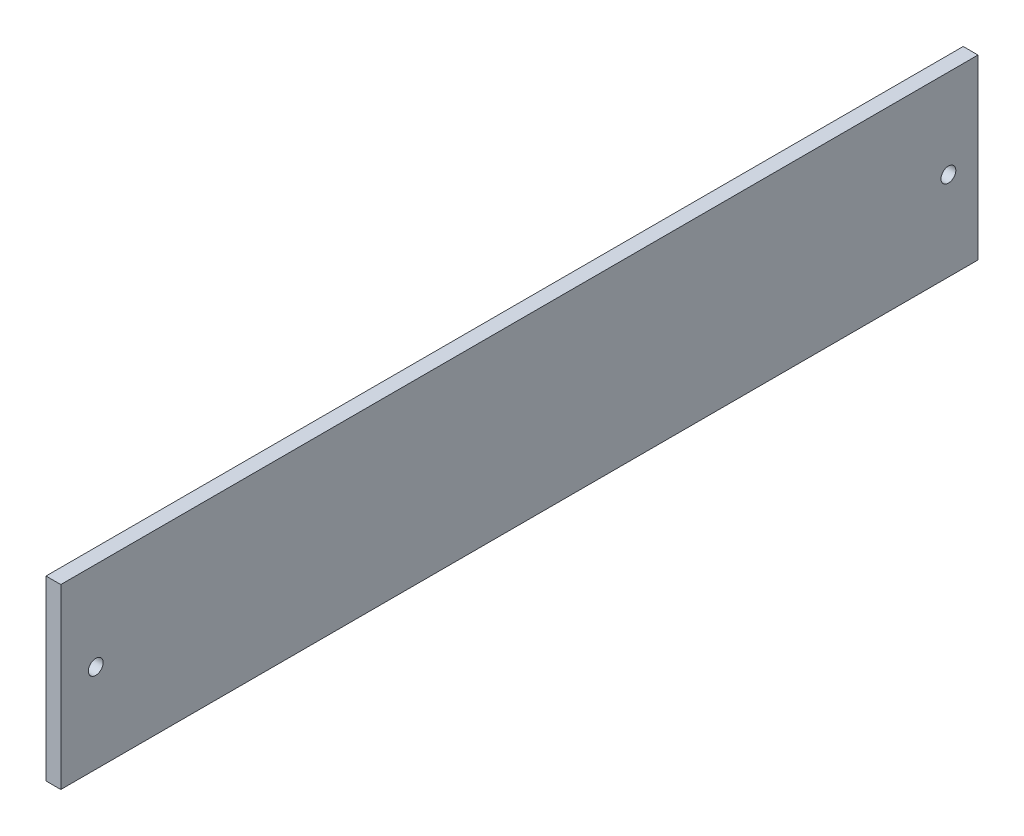
ISO-10303-21;
HEADER;
FILE_DESCRIPTION(('STEP AP214'),'2;1');
FILE_NAME('part.step','',(''),(''),'','','');
FILE_SCHEMA(('AUTOMOTIVE_DESIGN { 1 0 10303 214 1 1 1 1 }'));
ENDSEC;
DATA;
#1=APPLICATION_CONTEXT('core data for automotive mechanical design processes');
#2=APPLICATION_PROTOCOL_DEFINITION('international standard','automotive_design',2000,#1);
#3=PRODUCT_CONTEXT('',#1,'mechanical');
#4=PRODUCT('Part','Part','',(#3));
#5=PRODUCT_RELATED_PRODUCT_CATEGORY('part','',(#4));
#6=PRODUCT_DEFINITION_FORMATION('','',#4);
#7=PRODUCT_DEFINITION_CONTEXT('part definition',#1,'design');
#8=PRODUCT_DEFINITION('design','',#6,#7);
#9=PRODUCT_DEFINITION_SHAPE('','',#8);
#10=(LENGTH_UNIT() NAMED_UNIT(*) SI_UNIT(.MILLI.,.METRE.));
#11=(NAMED_UNIT(*) PLANE_ANGLE_UNIT() SI_UNIT($,.RADIAN.));
#12=(NAMED_UNIT(*) SI_UNIT($,.STERADIAN.) SOLID_ANGLE_UNIT());
#13=UNCERTAINTY_MEASURE_WITH_UNIT(LENGTH_MEASURE(1.E-05),#10,'distance_accuracy_value','');
#14=(GEOMETRIC_REPRESENTATION_CONTEXT(3) GLOBAL_UNCERTAINTY_ASSIGNED_CONTEXT((#13)) GLOBAL_UNIT_ASSIGNED_CONTEXT((#10,
#11,#12)) REPRESENTATION_CONTEXT('',''));
#15=CARTESIAN_POINT('',(0.,0.,0.));
#16=DIRECTION('',(0.,0.,1.));
#17=DIRECTION('',(1.,0.,0.));
#18=AXIS2_PLACEMENT_3D('',#15,#16,#17);
#19=CARTESIAN_POINT('',(6.35,-38.1,196.85));
#20=DIRECTION('',(0.,0.,-1.));
#21=DIRECTION('',(-1.,0.,0.));
#22=AXIS2_PLACEMENT_3D('',#19,#20,#21);
#23=PLANE('',#22);
#24=DIRECTION('',(0.,-1.,0.));
#25=VECTOR('',#24,1.);
#26=CARTESIAN_POINT('',(0.,-38.1,196.85));
#27=LINE('',#26,#25);
#28=CARTESIAN_POINT('',(0.,38.1,196.85));
#29=VERTEX_POINT('',#28);
#30=CARTESIAN_POINT('',(0.,-38.1,196.85));
#31=VERTEX_POINT('',#30);
#32=EDGE_CURVE('E96',#29,#31,#27,.T.);
#33=ORIENTED_EDGE('',*,*,#32,.T.);
#34=DIRECTION('',(-1.,0.,0.));
#35=VECTOR('',#34,1.);
#36=CARTESIAN_POINT('',(6.35,-38.1,196.85));
#37=LINE('',#36,#35);
#38=CARTESIAN_POINT('',(6.35,-38.1,196.85));
#39=VERTEX_POINT('',#38);
#40=EDGE_CURVE('E11',#39,#31,#37,.T.);
#41=ORIENTED_EDGE('',*,*,#40,.F.);
#42=DIRECTION('',(0.,-1.,0.));
#43=VECTOR('',#42,1.);
#44=CARTESIAN_POINT('',(6.35,-38.1,196.85));
#45=LINE('',#44,#43);
#46=CARTESIAN_POINT('',(6.35,38.1,196.85));
#47=VERTEX_POINT('',#46);
#48=EDGE_CURVE('E84',#47,#39,#45,.T.);
#49=ORIENTED_EDGE('',*,*,#48,.F.);
#50=DIRECTION('',(-1.,0.,0.));
#51=VECTOR('',#50,1.);
#52=CARTESIAN_POINT('',(6.35,38.1,196.85));
#53=LINE('',#52,#51);
#54=EDGE_CURVE('E92',#47,#29,#53,.T.);
#55=ORIENTED_EDGE('',*,*,#54,.T.);
#56=EDGE_LOOP('',(#33,#41,#49,#55));
#57=FACE_BOUND('',#56,.T.);
#58=ADVANCED_FACE('F33',(#57),#23,.F.);
#59=CARTESIAN_POINT('',(6.35,-38.1,-196.85));
#60=DIRECTION('',(0.,1.,0.));
#61=DIRECTION('',(0.,0.,1.));
#62=AXIS2_PLACEMENT_3D('',#59,#60,#61);
#63=PLANE('',#62);
#64=DIRECTION('',(0.,0.,-1.));
#65=VECTOR('',#64,1.);
#66=CARTESIAN_POINT('',(0.,-38.1,-196.85));
#67=LINE('',#66,#65);
#68=CARTESIAN_POINT('',(0.,-38.1,-196.85));
#69=VERTEX_POINT('',#68);
#70=EDGE_CURVE('E88',#31,#69,#67,.T.);
#71=ORIENTED_EDGE('',*,*,#70,.T.);
#72=DIRECTION('',(-1.,0.,0.));
#73=VECTOR('',#72,1.);
#74=CARTESIAN_POINT('',(6.35,-38.1,-196.85));
#75=LINE('',#74,#73);
#76=CARTESIAN_POINT('',(6.35,-38.1,-196.85));
#77=VERTEX_POINT('',#76);
#78=EDGE_CURVE('E41',#77,#69,#75,.T.);
#79=ORIENTED_EDGE('',*,*,#78,.F.);
#80=DIRECTION('',(0.,0.,-1.));
#81=VECTOR('',#80,1.);
#82=CARTESIAN_POINT('',(6.35,-38.1,-196.85));
#83=LINE('',#82,#81);
#84=EDGE_CURVE('E79',#39,#77,#83,.T.);
#85=ORIENTED_EDGE('',*,*,#84,.F.);
#86=ORIENTED_EDGE('',*,*,#40,.T.);
#87=EDGE_LOOP('',(#71,#79,#85,#86));
#88=FACE_BOUND('',#87,.T.);
#89=ADVANCED_FACE('F87',(#88),#63,.F.);
#90=CARTESIAN_POINT('',(6.35,-38.1,-196.85));
#91=DIRECTION('',(0.,0.,1.));
#92=DIRECTION('',(1.,0.,0.));
#93=AXIS2_PLACEMENT_3D('',#90,#91,#92);
#94=PLANE('',#93);
#95=DIRECTION('',(0.,1.,0.));
#96=VECTOR('',#95,1.);
#97=CARTESIAN_POINT('',(0.,-38.1,-196.85));
#98=LINE('',#97,#96);
#99=CARTESIAN_POINT('',(0.,38.1,-196.85));
#100=VERTEX_POINT('',#99);
#101=EDGE_CURVE('E66',#69,#100,#98,.T.);
#102=ORIENTED_EDGE('',*,*,#101,.T.);
#103=DIRECTION('',(-1.,0.,0.));
#104=VECTOR('',#103,1.);
#105=CARTESIAN_POINT('',(6.35,38.1,-196.85));
#106=LINE('',#105,#104);
#107=CARTESIAN_POINT('',(6.35,38.1,-196.85));
#108=VERTEX_POINT('',#107);
#109=EDGE_CURVE('E89',#108,#100,#106,.T.);
#110=ORIENTED_EDGE('',*,*,#109,.F.);
#111=DIRECTION('',(0.,1.,0.));
#112=VECTOR('',#111,1.);
#113=CARTESIAN_POINT('',(6.35,-38.1,-196.85));
#114=LINE('',#113,#112);
#115=EDGE_CURVE('E82',#77,#108,#114,.T.);
#116=ORIENTED_EDGE('',*,*,#115,.F.);
#117=ORIENTED_EDGE('',*,*,#78,.T.);
#118=EDGE_LOOP('',(#102,#110,#116,#117));
#119=FACE_BOUND('',#118,.T.);
#120=ADVANCED_FACE('F90',(#119),#94,.F.);
#121=CARTESIAN_POINT('',(6.35,38.1,-196.85));
#122=DIRECTION('',(0.,-1.,0.));
#123=DIRECTION('',(0.,0.,-1.));
#124=AXIS2_PLACEMENT_3D('',#121,#122,#123);
#125=PLANE('',#124);
#126=DIRECTION('',(0.,0.,1.));
#127=VECTOR('',#126,1.);
#128=CARTESIAN_POINT('',(0.,38.1,-196.85));
#129=LINE('',#128,#127);
#130=EDGE_CURVE('E72',#100,#29,#129,.T.);
#131=ORIENTED_EDGE('',*,*,#130,.T.);
#132=ORIENTED_EDGE('',*,*,#54,.F.);
#133=DIRECTION('',(0.,0.,1.));
#134=VECTOR('',#133,1.);
#135=CARTESIAN_POINT('',(6.35,38.1,-196.85));
#136=LINE('',#135,#134);
#137=EDGE_CURVE('E49',#108,#47,#136,.T.);
#138=ORIENTED_EDGE('',*,*,#137,.F.);
#139=ORIENTED_EDGE('',*,*,#109,.T.);
#140=EDGE_LOOP('',(#131,#132,#138,#139));
#141=FACE_BOUND('',#140,.T.);
#142=ADVANCED_FACE('F104',(#141),#125,.F.);
#143=CARTESIAN_POINT('',(6.35,0.,0.));
#144=DIRECTION('',(1.,0.,0.));
#145=DIRECTION('',(0.,0.,-1.));
#146=AXIS2_PLACEMENT_3D('',#143,#144,#145);
#147=PLANE('',#146);
#148=CARTESIAN_POINT('',(6.35,0.,-184.15));
#149=DIRECTION('',(1.,0.,0.));
#150=DIRECTION('',(0.,0.,-1.));
#151=AXIS2_PLACEMENT_3D('',#148,#149,#150);
#152=CIRCLE('',#151,3.175);
#153=CARTESIAN_POINT('',(6.35,0.,-180.975));
#154=VERTEX_POINT('',#153);
#155=EDGE_CURVE('E115',#154,#154,#152,.F.);
#156=ORIENTED_EDGE('',*,*,#155,.T.);
#157=EDGE_LOOP('',(#156));
#158=FACE_BOUND('',#157,.T.);
#159=CARTESIAN_POINT('',(6.35,0.,181.85));
#160=DIRECTION('',(1.,0.,0.));
#161=DIRECTION('',(0.,0.,-1.));
#162=AXIS2_PLACEMENT_3D('',#159,#160,#161);
#163=CIRCLE('',#162,3.175);
#164=CARTESIAN_POINT('',(6.35,0.,185.025));
#165=VERTEX_POINT('',#164);
#166=EDGE_CURVE('E99',#165,#165,#163,.F.);
#167=ORIENTED_EDGE('',*,*,#166,.T.);
#168=EDGE_LOOP('',(#167));
#169=FACE_BOUND('',#168,.T.);
#170=ORIENTED_EDGE('',*,*,#48,.T.);
#171=ORIENTED_EDGE('',*,*,#84,.T.);
#172=ORIENTED_EDGE('',*,*,#115,.T.);
#173=ORIENTED_EDGE('',*,*,#137,.T.);
#174=EDGE_LOOP('',(#170,#171,#172,#173));
#175=FACE_BOUND('',#174,.T.);
#176=ADVANCED_FACE('F80',(#158,#169,#175),#147,.T.);
#177=CARTESIAN_POINT('',(0.,0.,0.));
#178=DIRECTION('',(1.,0.,0.));
#179=DIRECTION('',(0.,0.,-1.));
#180=AXIS2_PLACEMENT_3D('',#177,#178,#179);
#181=PLANE('',#180);
#182=CARTESIAN_POINT('',(0.,0.,-184.15));
#183=DIRECTION('',(-1.,0.,0.));
#184=DIRECTION('',(0.,0.,1.));
#185=AXIS2_PLACEMENT_3D('',#182,#183,#184);
#186=CIRCLE('',#185,3.175);
#187=CARTESIAN_POINT('',(0.,0.,-180.975));
#188=VERTEX_POINT('',#187);
#189=EDGE_CURVE('E118',#188,#188,#186,.T.);
#190=ORIENTED_EDGE('',*,*,#189,.F.);
#191=EDGE_LOOP('',(#190));
#192=FACE_BOUND('',#191,.T.);
#193=CARTESIAN_POINT('',(0.,0.,181.85));
#194=DIRECTION('',(-1.,0.,0.));
#195=DIRECTION('',(0.,0.,1.));
#196=AXIS2_PLACEMENT_3D('',#193,#194,#195);
#197=CIRCLE('',#196,3.175);
#198=CARTESIAN_POINT('',(0.,0.,185.025));
#199=VERTEX_POINT('',#198);
#200=EDGE_CURVE('E112',#199,#199,#197,.T.);
#201=ORIENTED_EDGE('',*,*,#200,.F.);
#202=EDGE_LOOP('',(#201));
#203=FACE_BOUND('',#202,.T.);
#204=ORIENTED_EDGE('',*,*,#32,.F.);
#205=ORIENTED_EDGE('',*,*,#130,.F.);
#206=ORIENTED_EDGE('',*,*,#101,.F.);
#207=ORIENTED_EDGE('',*,*,#70,.F.);
#208=EDGE_LOOP('',(#204,#205,#206,#207));
#209=FACE_BOUND('',#208,.T.);
#210=ADVANCED_FACE('F107',(#192,#203,#209),#181,.F.);
#211=CARTESIAN_POINT('',(15.3302561210692,0.,181.85));
#212=DIRECTION('',(-1.,0.,0.));
#213=DIRECTION('',(0.,0.,1.));
#214=AXIS2_PLACEMENT_3D('',#211,#212,#213);
#215=CYLINDRICAL_SURFACE('',#214,3.175);
#216=CARTESIAN_POINT('',(0.,0.,185.025));
#217=CARTESIAN_POINT('',(0.0661458333333336,0.,185.025));
#218=CARTESIAN_POINT('',(0.132291666666667,0.,185.025));
#219=CARTESIAN_POINT('',(0.264583333333334,0.,185.025));
#220=CARTESIAN_POINT('',(0.330729166666667,0.,185.025));
#221=CARTESIAN_POINT('',(0.463020833333333,0.,185.025));
#222=CARTESIAN_POINT('',(0.529166666666667,0.,185.025));
#223=CARTESIAN_POINT('',(0.661458333333333,0.,185.025));
#224=CARTESIAN_POINT('',(0.727604166666666,0.,185.025));
#225=CARTESIAN_POINT('',(0.859895833333333,0.,185.025));
#226=CARTESIAN_POINT('',(0.926041666666666,0.,185.025));
#227=CARTESIAN_POINT('',(1.05833333333333,0.,185.025));
#228=CARTESIAN_POINT('',(1.12447916666667,0.,185.025));
#229=CARTESIAN_POINT('',(1.25677083333333,0.,185.025));
#230=CARTESIAN_POINT('',(1.32291666666667,0.,185.025));
#231=CARTESIAN_POINT('',(1.45520833333333,0.,185.025));
#232=CARTESIAN_POINT('',(1.52135416666667,0.,185.025));
#233=CARTESIAN_POINT('',(1.65364583333333,0.,185.025));
#234=CARTESIAN_POINT('',(1.71979166666667,0.,185.025));
#235=CARTESIAN_POINT('',(1.85208333333333,0.,185.025));
#236=CARTESIAN_POINT('',(1.91822916666667,0.,185.025));
#237=CARTESIAN_POINT('',(2.05052083333333,0.,185.025));
#238=CARTESIAN_POINT('',(2.11666666666667,0.,185.025));
#239=CARTESIAN_POINT('',(2.24895833333333,0.,185.025));
#240=CARTESIAN_POINT('',(2.31510416666667,0.,185.025));
#241=CARTESIAN_POINT('',(2.44739583333333,0.,185.025));
#242=CARTESIAN_POINT('',(2.51354166666667,0.,185.025));
#243=CARTESIAN_POINT('',(2.64583333333333,0.,185.025));
#244=CARTESIAN_POINT('',(2.71197916666667,0.,185.025));
#245=CARTESIAN_POINT('',(2.84427083333333,0.,185.025));
#246=CARTESIAN_POINT('',(2.91041666666667,0.,185.025));
#247=CARTESIAN_POINT('',(3.04270833333333,0.,185.025));
#248=CARTESIAN_POINT('',(3.10885416666667,0.,185.025));
#249=CARTESIAN_POINT('',(3.24114583333333,0.,185.025));
#250=CARTESIAN_POINT('',(3.30729166666667,0.,185.025));
#251=CARTESIAN_POINT('',(3.43958333333333,0.,185.025));
#252=CARTESIAN_POINT('',(3.50572916666667,0.,185.025));
#253=CARTESIAN_POINT('',(3.63802083333333,0.,185.025));
#254=CARTESIAN_POINT('',(3.70416666666667,0.,185.025));
#255=CARTESIAN_POINT('',(3.83645833333333,0.,185.025));
#256=CARTESIAN_POINT('',(3.90260416666667,0.,185.025));
#257=CARTESIAN_POINT('',(4.03489583333333,0.,185.025));
#258=CARTESIAN_POINT('',(4.10104166666667,0.,185.025));
#259=CARTESIAN_POINT('',(4.23333333333333,0.,185.025));
#260=CARTESIAN_POINT('',(4.29947916666667,0.,185.025));
#261=CARTESIAN_POINT('',(4.43177083333333,0.,185.025));
#262=CARTESIAN_POINT('',(4.49791666666667,0.,185.025));
#263=CARTESIAN_POINT('',(4.63020833333333,0.,185.025));
#264=CARTESIAN_POINT('',(4.69635416666667,0.,185.025));
#265=CARTESIAN_POINT('',(4.82864583333333,0.,185.025));
#266=CARTESIAN_POINT('',(4.89479166666667,0.,185.025));
#267=CARTESIAN_POINT('',(5.02708333333333,0.,185.025));
#268=CARTESIAN_POINT('',(5.09322916666666,0.,185.025));
#269=CARTESIAN_POINT('',(5.22552083333333,0.,185.025));
#270=CARTESIAN_POINT('',(5.29166666666666,0.,185.025));
#271=CARTESIAN_POINT('',(5.42395833333333,0.,185.025));
#272=CARTESIAN_POINT('',(5.49010416666667,0.,185.025));
#273=CARTESIAN_POINT('',(5.62239583333333,0.,185.025));
#274=CARTESIAN_POINT('',(5.68854166666666,0.,185.025));
#275=CARTESIAN_POINT('',(5.82083333333333,0.,185.025));
#276=CARTESIAN_POINT('',(5.88697916666666,0.,185.025));
#277=CARTESIAN_POINT('',(6.01927083333333,0.,185.025));
#278=CARTESIAN_POINT('',(6.08541666666667,0.,185.025));
#279=CARTESIAN_POINT('',(6.21770833333333,0.,185.025));
#280=CARTESIAN_POINT('',(6.28385416666667,0.,185.025));
#281=CARTESIAN_POINT('',(6.35,0.,185.025));
#282=B_SPLINE_CURVE_WITH_KNOTS('',3,(#216,#217,#218,#219,#220,#221,#222,#223,#224,#225,#226,
#227,#228,#229,#230,#231,#232,#233,#234,#235,#236,#237,#238,#239,#240,#241,#242,#243,#244,#245,
#246,#247,#248,#249,#250,#251,#252,#253,#254,#255,#256,#257,#258,#259,#260,#261,#262,#263,#264,
#265,#266,#267,#268,#269,#270,#271,#272,#273,#274,#275,#276,#277,#278,#279,#280,#281),
.UNSPECIFIED.,.F.,.F.,(4,2,2,2,2,2,2,2,2,2,2,2,2,2,2,2,2,2,2,2,2,2,2,2,2,2,2,2,2,2,2,2,4),(0.,
0.198437500000001,0.396875,0.5953125,0.793749999999999,0.9921875,1.190625,1.3890625,1.5875,
1.7859375,1.984375,2.1828125,2.38125,2.5796875,2.778125,2.9765625,3.175,3.3734375,3.571875,
3.7703125,3.96875,4.1671875,4.365625,4.5640625,4.7625,4.9609375,5.159375,5.3578125,5.55625,
5.7546875,5.953125,6.1515625,6.35),.UNSPECIFIED.);
#283=EDGE_CURVE('BSEAM127',#199,#165,#282,.T.);
#284=ORIENTED_EDGE('',*,*,#200,.T.);
#285=ORIENTED_EDGE('',*,*,#166,.F.);
#286=ORIENTED_EDGE('',*,*,#283,.T.);
#287=ORIENTED_EDGE('',*,*,#283,.F.);
#288=EDGE_LOOP('',(#284,#286,#285,#287));
#289=FACE_BOUND('',#288,.T.);
#290=ADVANCED_FACE('F127',(#289),#215,.F.);
#291=CARTESIAN_POINT('',(15.3302561210692,0.,-184.15));
#292=DIRECTION('',(-1.,0.,0.));
#293=DIRECTION('',(0.,0.,1.));
#294=AXIS2_PLACEMENT_3D('',#291,#292,#293);
#295=CYLINDRICAL_SURFACE('',#294,3.175);
#296=CARTESIAN_POINT('',(0.,0.,-180.975));
#297=CARTESIAN_POINT('',(0.0661458333333336,0.,-180.975));
#298=CARTESIAN_POINT('',(0.132291666666667,0.,-180.975));
#299=CARTESIAN_POINT('',(0.264583333333334,0.,-180.975));
#300=CARTESIAN_POINT('',(0.330729166666667,0.,-180.975));
#301=CARTESIAN_POINT('',(0.463020833333333,0.,-180.975));
#302=CARTESIAN_POINT('',(0.529166666666667,0.,-180.975));
#303=CARTESIAN_POINT('',(0.661458333333333,0.,-180.975));
#304=CARTESIAN_POINT('',(0.727604166666666,0.,-180.975));
#305=CARTESIAN_POINT('',(0.859895833333333,0.,-180.975));
#306=CARTESIAN_POINT('',(0.926041666666666,0.,-180.975));
#307=CARTESIAN_POINT('',(1.05833333333333,0.,-180.975));
#308=CARTESIAN_POINT('',(1.12447916666667,0.,-180.975));
#309=CARTESIAN_POINT('',(1.25677083333333,0.,-180.975));
#310=CARTESIAN_POINT('',(1.32291666666667,0.,-180.975));
#311=CARTESIAN_POINT('',(1.45520833333333,0.,-180.975));
#312=CARTESIAN_POINT('',(1.52135416666667,0.,-180.975));
#313=CARTESIAN_POINT('',(1.65364583333333,0.,-180.975));
#314=CARTESIAN_POINT('',(1.71979166666667,0.,-180.975));
#315=CARTESIAN_POINT('',(1.85208333333333,0.,-180.975));
#316=CARTESIAN_POINT('',(1.91822916666667,0.,-180.975));
#317=CARTESIAN_POINT('',(2.05052083333333,0.,-180.975));
#318=CARTESIAN_POINT('',(2.11666666666667,0.,-180.975));
#319=CARTESIAN_POINT('',(2.24895833333333,0.,-180.975));
#320=CARTESIAN_POINT('',(2.31510416666667,0.,-180.975));
#321=CARTESIAN_POINT('',(2.44739583333333,0.,-180.975));
#322=CARTESIAN_POINT('',(2.51354166666667,0.,-180.975));
#323=CARTESIAN_POINT('',(2.64583333333333,0.,-180.975));
#324=CARTESIAN_POINT('',(2.71197916666667,0.,-180.975));
#325=CARTESIAN_POINT('',(2.84427083333333,0.,-180.975));
#326=CARTESIAN_POINT('',(2.91041666666667,0.,-180.975));
#327=CARTESIAN_POINT('',(3.04270833333333,0.,-180.975));
#328=CARTESIAN_POINT('',(3.10885416666667,0.,-180.975));
#329=CARTESIAN_POINT('',(3.24114583333333,0.,-180.975));
#330=CARTESIAN_POINT('',(3.30729166666667,0.,-180.975));
#331=CARTESIAN_POINT('',(3.43958333333333,0.,-180.975));
#332=CARTESIAN_POINT('',(3.50572916666667,0.,-180.975));
#333=CARTESIAN_POINT('',(3.63802083333333,0.,-180.975));
#334=CARTESIAN_POINT('',(3.70416666666667,0.,-180.975));
#335=CARTESIAN_POINT('',(3.83645833333333,0.,-180.975));
#336=CARTESIAN_POINT('',(3.90260416666667,0.,-180.975));
#337=CARTESIAN_POINT('',(4.03489583333333,0.,-180.975));
#338=CARTESIAN_POINT('',(4.10104166666667,0.,-180.975));
#339=CARTESIAN_POINT('',(4.23333333333333,0.,-180.975));
#340=CARTESIAN_POINT('',(4.29947916666667,0.,-180.975));
#341=CARTESIAN_POINT('',(4.43177083333333,0.,-180.975));
#342=CARTESIAN_POINT('',(4.49791666666667,0.,-180.975));
#343=CARTESIAN_POINT('',(4.63020833333333,0.,-180.975));
#344=CARTESIAN_POINT('',(4.69635416666667,0.,-180.975));
#345=CARTESIAN_POINT('',(4.82864583333333,0.,-180.975));
#346=CARTESIAN_POINT('',(4.89479166666667,0.,-180.975));
#347=CARTESIAN_POINT('',(5.02708333333333,0.,-180.975));
#348=CARTESIAN_POINT('',(5.09322916666666,0.,-180.975));
#349=CARTESIAN_POINT('',(5.22552083333333,0.,-180.975));
#350=CARTESIAN_POINT('',(5.29166666666666,0.,-180.975));
#351=CARTESIAN_POINT('',(5.42395833333333,0.,-180.975));
#352=CARTESIAN_POINT('',(5.49010416666667,0.,-180.975));
#353=CARTESIAN_POINT('',(5.62239583333333,0.,-180.975));
#354=CARTESIAN_POINT('',(5.68854166666666,0.,-180.975));
#355=CARTESIAN_POINT('',(5.82083333333333,0.,-180.975));
#356=CARTESIAN_POINT('',(5.88697916666666,0.,-180.975));
#357=CARTESIAN_POINT('',(6.01927083333333,0.,-180.975));
#358=CARTESIAN_POINT('',(6.08541666666667,0.,-180.975));
#359=CARTESIAN_POINT('',(6.21770833333333,0.,-180.975));
#360=CARTESIAN_POINT('',(6.28385416666667,0.,-180.975));
#361=CARTESIAN_POINT('',(6.35,0.,-180.975));
#362=B_SPLINE_CURVE_WITH_KNOTS('',3,(#296,#297,#298,#299,#300,#301,#302,#303,#304,#305,#306,
#307,#308,#309,#310,#311,#312,#313,#314,#315,#316,#317,#318,#319,#320,#321,#322,#323,#324,#325,
#326,#327,#328,#329,#330,#331,#332,#333,#334,#335,#336,#337,#338,#339,#340,#341,#342,#343,#344,
#345,#346,#347,#348,#349,#350,#351,#352,#353,#354,#355,#356,#357,#358,#359,#360,#361),
.UNSPECIFIED.,.F.,.F.,(4,2,2,2,2,2,2,2,2,2,2,2,2,2,2,2,2,2,2,2,2,2,2,2,2,2,2,2,2,2,2,2,4),(0.,
0.198437500000001,0.396875,0.5953125,0.793749999999999,0.9921875,1.190625,1.3890625,1.5875,
1.7859375,1.984375,2.1828125,2.38125,2.5796875,2.778125,2.9765625,3.175,3.3734375,3.571875,
3.7703125,3.96875,4.1671875,4.365625,4.5640625,4.7625,4.9609375,5.159375,5.3578125,5.55625,
5.7546875,5.953125,6.1515625,6.35),.UNSPECIFIED.);
#363=EDGE_CURVE('BSEAM122',#188,#154,#362,.T.);
#364=ORIENTED_EDGE('',*,*,#189,.T.);
#365=ORIENTED_EDGE('',*,*,#155,.F.);
#366=ORIENTED_EDGE('',*,*,#363,.T.);
#367=ORIENTED_EDGE('',*,*,#363,.F.);
#368=EDGE_LOOP('',(#364,#366,#365,#367));
#369=FACE_BOUND('',#368,.T.);
#370=ADVANCED_FACE('F122',(#369),#295,.F.);
#371=CLOSED_SHELL('',(#58,#89,#120,#142,#176,#210,#290,#370));
#372=MANIFOLD_SOLID_BREP('B2',#371);
#373=ADVANCED_BREP_SHAPE_REPRESENTATION('',(#18,#372),#14);
#374=SHAPE_DEFINITION_REPRESENTATION(#9,#373);
ENDSEC;
END-ISO-10303-21;
